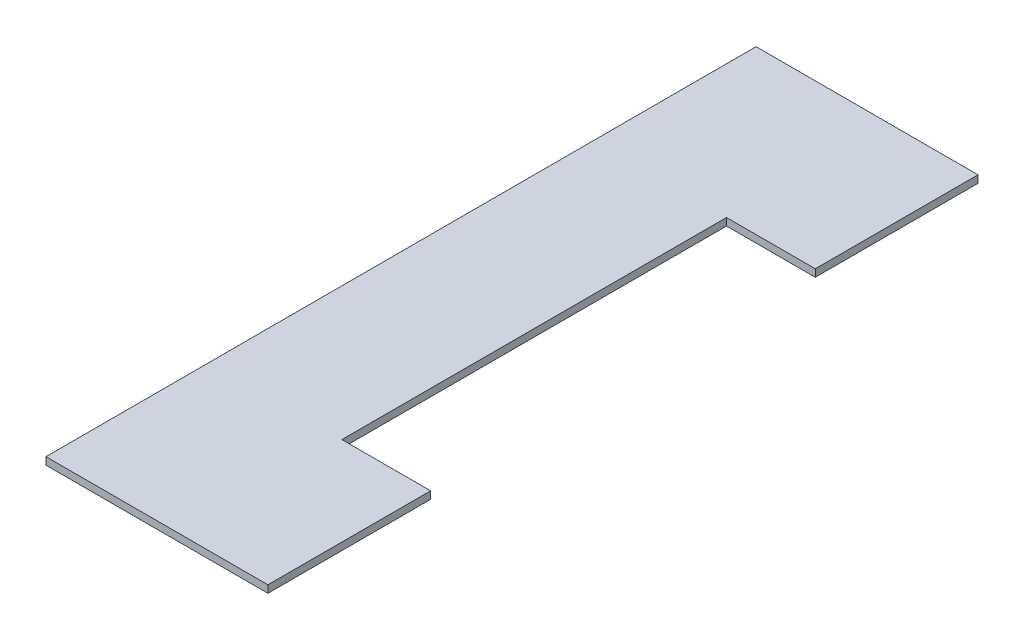
ISO-10303-21;
HEADER;
FILE_DESCRIPTION(('STEP AP214'),'2;1');
FILE_NAME('part.step','',(''),(''),'','','');
FILE_SCHEMA(('AUTOMOTIVE_DESIGN { 1 0 10303 214 1 1 1 1 }'));
ENDSEC;
DATA;
#1=APPLICATION_CONTEXT('core data for automotive mechanical design processes');
#2=APPLICATION_PROTOCOL_DEFINITION('international standard','automotive_design',2000,#1);
#3=PRODUCT_CONTEXT('',#1,'mechanical');
#4=PRODUCT('Part','Part','',(#3));
#5=PRODUCT_RELATED_PRODUCT_CATEGORY('part','',(#4));
#6=PRODUCT_DEFINITION_FORMATION('','',#4);
#7=PRODUCT_DEFINITION_CONTEXT('part definition',#1,'design');
#8=PRODUCT_DEFINITION('design','',#6,#7);
#9=PRODUCT_DEFINITION_SHAPE('','',#8);
#10=(LENGTH_UNIT() NAMED_UNIT(*) SI_UNIT(.MILLI.,.METRE.));
#11=(NAMED_UNIT(*) PLANE_ANGLE_UNIT() SI_UNIT($,.RADIAN.));
#12=(NAMED_UNIT(*) SI_UNIT($,.STERADIAN.) SOLID_ANGLE_UNIT());
#13=UNCERTAINTY_MEASURE_WITH_UNIT(LENGTH_MEASURE(1.E-05),#10,'distance_accuracy_value','');
#14=(GEOMETRIC_REPRESENTATION_CONTEXT(3) GLOBAL_UNCERTAINTY_ASSIGNED_CONTEXT((#13)) GLOBAL_UNIT_ASSIGNED_CONTEXT((#10,
#11,#12)) REPRESENTATION_CONTEXT('',''));
#15=CARTESIAN_POINT('',(0.,0.,0.));
#16=DIRECTION('',(0.,0.,1.));
#17=DIRECTION('',(1.,0.,0.));
#18=AXIS2_PLACEMENT_3D('',#15,#16,#17);
#19=CARTESIAN_POINT('',(0.,6.35,0.));
#20=DIRECTION('',(0.,1.,0.));
#21=DIRECTION('',(0.,0.,1.));
#22=AXIS2_PLACEMENT_3D('',#19,#20,#21);
#23=PLANE('',#22);
#24=DIRECTION('',(1.,0.,0.));
#25=VECTOR('',#24,1.);
#26=CARTESIAN_POINT('',(19.05,6.35,165.1));
#27=LINE('',#26,#25);
#28=CARTESIAN_POINT('',(95.25,6.35,165.1));
#29=VERTEX_POINT('',#28);
#30=CARTESIAN_POINT('',(19.05,6.35,165.1));
#31=VERTEX_POINT('',#30);
#32=EDGE_CURVE('E132',#29,#31,#27,.F.);
#33=ORIENTED_EDGE('',*,*,#32,.T.);
#34=DIRECTION('',(0.,0.,1.));
#35=VECTOR('',#34,1.);
#36=CARTESIAN_POINT('',(19.05,6.35,-165.1));
#37=LINE('',#36,#35);
#38=CARTESIAN_POINT('',(19.05,6.35,-165.1));
#39=VERTEX_POINT('',#38);
#40=EDGE_CURVE('E137',#31,#39,#37,.F.);
#41=ORIENTED_EDGE('',*,*,#40,.T.);
#42=DIRECTION('',(-1.,0.,0.));
#43=VECTOR('',#42,1.);
#44=CARTESIAN_POINT('',(95.25,6.35,-165.1));
#45=LINE('',#44,#43);
#46=CARTESIAN_POINT('',(95.25,6.35,-165.1));
#47=VERTEX_POINT('',#46);
#48=EDGE_CURVE('E110',#39,#47,#45,.F.);
#49=ORIENTED_EDGE('',*,*,#48,.T.);
#50=DIRECTION('',(0.,0.,-1.));
#51=VECTOR('',#50,1.);
#52=CARTESIAN_POINT('',(95.25,6.35,304.8));
#53=LINE('',#52,#51);
#54=CARTESIAN_POINT('',(95.25,6.35,-304.8));
#55=VERTEX_POINT('',#54);
#56=EDGE_CURVE('E36',#55,#47,#53,.F.);
#57=ORIENTED_EDGE('',*,*,#56,.F.);
#58=DIRECTION('',(-1.,0.,0.));
#59=VECTOR('',#58,1.);
#60=CARTESIAN_POINT('',(95.25,6.35,-304.8));
#61=LINE('',#60,#59);
#62=CARTESIAN_POINT('',(-95.25,6.35,-304.8));
#63=VERTEX_POINT('',#62);
#64=EDGE_CURVE('E100',#63,#55,#61,.F.);
#65=ORIENTED_EDGE('',*,*,#64,.F.);
#66=DIRECTION('',(0.,0.,1.));
#67=VECTOR('',#66,1.);
#68=CARTESIAN_POINT('',(-95.25,6.35,-304.8));
#69=LINE('',#68,#67);
#70=CARTESIAN_POINT('',(-95.25,6.35,304.8));
#71=VERTEX_POINT('',#70);
#72=EDGE_CURVE('E95',#71,#63,#69,.F.);
#73=ORIENTED_EDGE('',*,*,#72,.F.);
#74=DIRECTION('',(1.,0.,0.));
#75=VECTOR('',#74,1.);
#76=CARTESIAN_POINT('',(-95.25,6.35,304.8));
#77=LINE('',#76,#75);
#78=CARTESIAN_POINT('',(95.25,6.35,304.8));
#79=VERTEX_POINT('',#78);
#80=EDGE_CURVE('E121',#79,#71,#77,.F.);
#81=ORIENTED_EDGE('',*,*,#80,.F.);
#82=DIRECTION('',(0.,0.,-1.));
#83=VECTOR('',#82,1.);
#84=CARTESIAN_POINT('',(95.25,6.35,304.8));
#85=LINE('',#84,#83);
#86=EDGE_CURVE('E125',#29,#79,#85,.F.);
#87=ORIENTED_EDGE('',*,*,#86,.F.);
#88=EDGE_LOOP('',(#33,#41,#49,#57,#65,#73,#81,#87));
#89=FACE_BOUND('',#88,.T.);
#90=ADVANCED_FACE('F33',(#89),#23,.T.);
#91=CARTESIAN_POINT('',(95.25,0.,304.8));
#92=DIRECTION('',(1.,0.,0.));
#93=DIRECTION('',(0.,0.,-1.));
#94=AXIS2_PLACEMENT_3D('',#91,#92,#93);
#95=PLANE('',#94);
#96=DIRECTION('',(0.,1.,0.));
#97=VECTOR('',#96,1.);
#98=CARTESIAN_POINT('',(95.25,0.,-304.8));
#99=LINE('',#98,#97);
#100=CARTESIAN_POINT('',(95.25,0.,-304.8));
#101=VERTEX_POINT('',#100);
#102=EDGE_CURVE('E105',#55,#101,#99,.F.);
#103=ORIENTED_EDGE('',*,*,#102,.F.);
#104=ORIENTED_EDGE('',*,*,#56,.T.);
#105=DIRECTION('',(0.,1.,0.));
#106=VECTOR('',#105,1.);
#107=CARTESIAN_POINT('',(95.25,6.35,-165.1));
#108=LINE('',#107,#106);
#109=CARTESIAN_POINT('',(95.25,0.,-165.1));
#110=VERTEX_POINT('',#109);
#111=EDGE_CURVE('E141',#47,#110,#108,.F.);
#112=ORIENTED_EDGE('',*,*,#111,.T.);
#113=DIRECTION('',(0.,0.,1.));
#114=VECTOR('',#113,1.);
#115=CARTESIAN_POINT('',(95.25,0.,0.));
#116=LINE('',#115,#114);
#117=EDGE_CURVE('E116',#110,#101,#116,.F.);
#118=ORIENTED_EDGE('',*,*,#117,.T.);
#119=EDGE_LOOP('',(#103,#104,#112,#118));
#120=FACE_BOUND('',#119,.T.);
#121=ADVANCED_FACE('F115',(#120),#95,.T.);
#122=CARTESIAN_POINT('',(95.25,0.,-304.8));
#123=DIRECTION('',(0.,0.,-1.));
#124=DIRECTION('',(-1.,0.,0.));
#125=AXIS2_PLACEMENT_3D('',#122,#123,#124);
#126=PLANE('',#125);
#127=ORIENTED_EDGE('',*,*,#64,.T.);
#128=ORIENTED_EDGE('',*,*,#102,.T.);
#129=DIRECTION('',(1.,0.,0.));
#130=VECTOR('',#129,1.);
#131=CARTESIAN_POINT('',(0.,0.,-304.8));
#132=LINE('',#131,#130);
#133=CARTESIAN_POINT('',(-95.25,0.,-304.8));
#134=VERTEX_POINT('',#133);
#135=EDGE_CURVE('E144',#101,#134,#132,.F.);
#136=ORIENTED_EDGE('',*,*,#135,.T.);
#137=DIRECTION('',(0.,1.,0.));
#138=VECTOR('',#137,1.);
#139=CARTESIAN_POINT('',(-95.25,0.,-304.8));
#140=LINE('',#139,#138);
#141=EDGE_CURVE('E107',#63,#134,#140,.F.);
#142=ORIENTED_EDGE('',*,*,#141,.F.);
#143=EDGE_LOOP('',(#127,#128,#136,#142));
#144=FACE_BOUND('',#143,.T.);
#145=ADVANCED_FACE('F102',(#144),#126,.T.);
#146=CARTESIAN_POINT('',(-95.25,0.,-304.8));
#147=DIRECTION('',(-1.,0.,0.));
#148=DIRECTION('',(0.,0.,1.));
#149=AXIS2_PLACEMENT_3D('',#146,#147,#148);
#150=PLANE('',#149);
#151=ORIENTED_EDGE('',*,*,#72,.T.);
#152=ORIENTED_EDGE('',*,*,#141,.T.);
#153=DIRECTION('',(0.,0.,1.));
#154=VECTOR('',#153,1.);
#155=CARTESIAN_POINT('',(-95.25,0.,0.));
#156=LINE('',#155,#154);
#157=CARTESIAN_POINT('',(-95.25,0.,304.8));
#158=VERTEX_POINT('',#157);
#159=EDGE_CURVE('E146',#134,#158,#156,.T.);
#160=ORIENTED_EDGE('',*,*,#159,.T.);
#161=DIRECTION('',(0.,1.,0.));
#162=VECTOR('',#161,1.);
#163=CARTESIAN_POINT('',(-95.25,0.,304.8));
#164=LINE('',#163,#162);
#165=EDGE_CURVE('E123',#71,#158,#164,.F.);
#166=ORIENTED_EDGE('',*,*,#165,.F.);
#167=EDGE_LOOP('',(#151,#152,#160,#166));
#168=FACE_BOUND('',#167,.T.);
#169=ADVANCED_FACE('F178',(#168),#150,.T.);
#170=CARTESIAN_POINT('',(-95.25,0.,304.8));
#171=DIRECTION('',(0.,0.,1.));
#172=DIRECTION('',(1.,0.,0.));
#173=AXIS2_PLACEMENT_3D('',#170,#171,#172);
#174=PLANE('',#173);
#175=ORIENTED_EDGE('',*,*,#80,.T.);
#176=ORIENTED_EDGE('',*,*,#165,.T.);
#177=DIRECTION('',(1.,0.,0.));
#178=VECTOR('',#177,1.);
#179=CARTESIAN_POINT('',(0.,0.,304.8));
#180=LINE('',#179,#178);
#181=CARTESIAN_POINT('',(95.25,0.,304.8));
#182=VERTEX_POINT('',#181);
#183=EDGE_CURVE('E149',#158,#182,#180,.T.);
#184=ORIENTED_EDGE('',*,*,#183,.T.);
#185=DIRECTION('',(0.,1.,0.));
#186=VECTOR('',#185,1.);
#187=CARTESIAN_POINT('',(95.25,0.,304.8));
#188=LINE('',#187,#186);
#189=EDGE_CURVE('E127',#79,#182,#188,.F.);
#190=ORIENTED_EDGE('',*,*,#189,.F.);
#191=EDGE_LOOP('',(#175,#176,#184,#190));
#192=FACE_BOUND('',#191,.T.);
#193=ADVANCED_FACE('F177',(#192),#174,.T.);
#194=CARTESIAN_POINT('',(95.25,0.,304.8));
#195=DIRECTION('',(1.,0.,0.));
#196=DIRECTION('',(0.,0.,-1.));
#197=AXIS2_PLACEMENT_3D('',#194,#195,#196);
#198=PLANE('',#197);
#199=ORIENTED_EDGE('',*,*,#189,.T.);
#200=DIRECTION('',(0.,0.,1.));
#201=VECTOR('',#200,1.);
#202=CARTESIAN_POINT('',(95.25,0.,0.));
#203=LINE('',#202,#201);
#204=CARTESIAN_POINT('',(95.25,0.,165.1));
#205=VERTEX_POINT('',#204);
#206=EDGE_CURVE('E152',#182,#205,#203,.F.);
#207=ORIENTED_EDGE('',*,*,#206,.T.);
#208=DIRECTION('',(0.,1.,0.));
#209=VECTOR('',#208,1.);
#210=CARTESIAN_POINT('',(95.25,6.35,165.1));
#211=LINE('',#210,#209);
#212=EDGE_CURVE('E129',#205,#29,#211,.T.);
#213=ORIENTED_EDGE('',*,*,#212,.T.);
#214=ORIENTED_EDGE('',*,*,#86,.T.);
#215=EDGE_LOOP('',(#199,#207,#213,#214));
#216=FACE_BOUND('',#215,.T.);
#217=ADVANCED_FACE('F171',(#216),#198,.T.);
#218=CARTESIAN_POINT('',(19.05,6.35,165.1));
#219=DIRECTION('',(0.,0.,1.));
#220=DIRECTION('',(1.,0.,0.));
#221=AXIS2_PLACEMENT_3D('',#218,#219,#220);
#222=PLANE('',#221);
#223=DIRECTION('',(0.,1.,0.));
#224=VECTOR('',#223,1.);
#225=CARTESIAN_POINT('',(19.05,6.35,165.1));
#226=LINE('',#225,#224);
#227=CARTESIAN_POINT('',(19.05,0.,165.1));
#228=VERTEX_POINT('',#227);
#229=EDGE_CURVE('E134',#228,#31,#226,.T.);
#230=ORIENTED_EDGE('',*,*,#229,.T.);
#231=ORIENTED_EDGE('',*,*,#32,.F.);
#232=ORIENTED_EDGE('',*,*,#212,.F.);
#233=DIRECTION('',(1.,0.,0.));
#234=VECTOR('',#233,1.);
#235=CARTESIAN_POINT('',(0.,0.,165.1));
#236=LINE('',#235,#234);
#237=EDGE_CURVE('E155',#205,#228,#236,.F.);
#238=ORIENTED_EDGE('',*,*,#237,.T.);
#239=EDGE_LOOP('',(#230,#231,#232,#238));
#240=FACE_BOUND('',#239,.T.);
#241=ADVANCED_FACE('F168',(#240),#222,.F.);
#242=CARTESIAN_POINT('',(19.05,6.35,-165.1));
#243=DIRECTION('',(-1.,0.,0.));
#244=DIRECTION('',(0.,0.,1.));
#245=AXIS2_PLACEMENT_3D('',#242,#243,#244);
#246=PLANE('',#245);
#247=DIRECTION('',(0.,1.,0.));
#248=VECTOR('',#247,1.);
#249=CARTESIAN_POINT('',(19.05,6.35,-165.1));
#250=LINE('',#249,#248);
#251=CARTESIAN_POINT('',(19.05,0.,-165.1));
#252=VERTEX_POINT('',#251);
#253=EDGE_CURVE('E50',#252,#39,#250,.T.);
#254=ORIENTED_EDGE('',*,*,#253,.T.);
#255=ORIENTED_EDGE('',*,*,#40,.F.);
#256=ORIENTED_EDGE('',*,*,#229,.F.);
#257=DIRECTION('',(0.,0.,1.));
#258=VECTOR('',#257,1.);
#259=CARTESIAN_POINT('',(19.05,0.,0.));
#260=LINE('',#259,#258);
#261=EDGE_CURVE('E42',#228,#252,#260,.F.);
#262=ORIENTED_EDGE('',*,*,#261,.T.);
#263=EDGE_LOOP('',(#254,#255,#256,#262));
#264=FACE_BOUND('',#263,.T.);
#265=ADVANCED_FACE('F161',(#264),#246,.F.);
#266=CARTESIAN_POINT('',(95.25,6.35,-165.1));
#267=DIRECTION('',(0.,0.,-1.));
#268=DIRECTION('',(-1.,0.,0.));
#269=AXIS2_PLACEMENT_3D('',#266,#267,#268);
#270=PLANE('',#269);
#271=ORIENTED_EDGE('',*,*,#111,.F.);
#272=ORIENTED_EDGE('',*,*,#48,.F.);
#273=ORIENTED_EDGE('',*,*,#253,.F.);
#274=DIRECTION('',(1.,0.,0.));
#275=VECTOR('',#274,1.);
#276=CARTESIAN_POINT('',(0.,0.,-165.1));
#277=LINE('',#276,#275);
#278=EDGE_CURVE('E11',#252,#110,#277,.T.);
#279=ORIENTED_EDGE('',*,*,#278,.T.);
#280=EDGE_LOOP('',(#271,#272,#273,#279));
#281=FACE_BOUND('',#280,.T.);
#282=ADVANCED_FACE('F179',(#281),#270,.F.);
#283=CARTESIAN_POINT('',(0.,0.,0.));
#284=DIRECTION('',(0.,1.,0.));
#285=DIRECTION('',(0.,0.,1.));
#286=AXIS2_PLACEMENT_3D('',#283,#284,#285);
#287=PLANE('',#286);
#288=ORIENTED_EDGE('',*,*,#261,.F.);
#289=ORIENTED_EDGE('',*,*,#237,.F.);
#290=ORIENTED_EDGE('',*,*,#206,.F.);
#291=ORIENTED_EDGE('',*,*,#183,.F.);
#292=ORIENTED_EDGE('',*,*,#159,.F.);
#293=ORIENTED_EDGE('',*,*,#135,.F.);
#294=ORIENTED_EDGE('',*,*,#117,.F.);
#295=ORIENTED_EDGE('',*,*,#278,.F.);
#296=EDGE_LOOP('',(#288,#289,#290,#291,#292,#293,#294,#295));
#297=FACE_BOUND('',#296,.T.);
#298=ADVANCED_FACE('F165',(#297),#287,.F.);
#299=CLOSED_SHELL('',(#90,#121,#145,#169,#193,#217,#241,#265,#282,#298));
#300=MANIFOLD_SOLID_BREP('B2',#299);
#301=ADVANCED_BREP_SHAPE_REPRESENTATION('',(#18,#300),#14);
#302=SHAPE_DEFINITION_REPRESENTATION(#9,#301);
ENDSEC;
END-ISO-10303-21;
